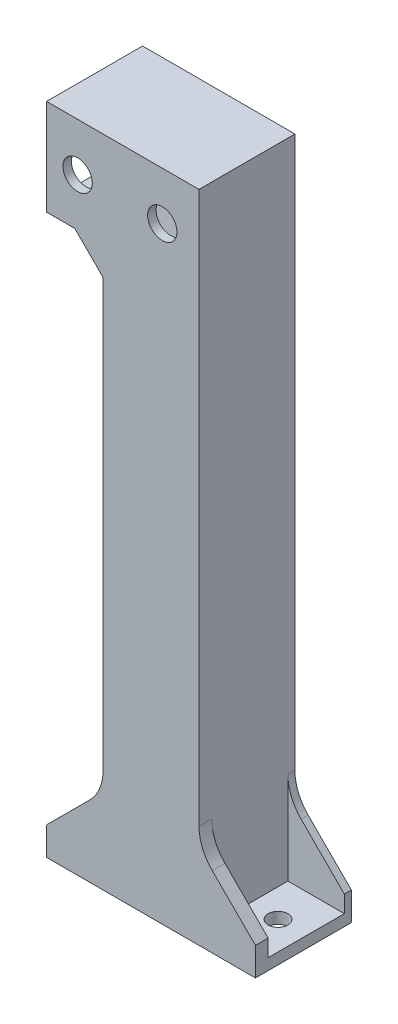
ISO-10303-21;
HEADER;
FILE_DESCRIPTION(('STEP AP214'),'2;1');
FILE_NAME('part.step','',(''),(''),'','','');
FILE_SCHEMA(('AUTOMOTIVE_DESIGN { 1 0 10303 214 1 1 1 1 }'));
ENDSEC;
DATA;
#1=APPLICATION_CONTEXT('core data for automotive mechanical design processes');
#2=APPLICATION_PROTOCOL_DEFINITION('international standard','automotive_design',2000,#1);
#3=PRODUCT_CONTEXT('',#1,'mechanical');
#4=PRODUCT('Part','Part','',(#3));
#5=PRODUCT_RELATED_PRODUCT_CATEGORY('part','',(#4));
#6=PRODUCT_DEFINITION_FORMATION('','',#4);
#7=PRODUCT_DEFINITION_CONTEXT('part definition',#1,'design');
#8=PRODUCT_DEFINITION('design','',#6,#7);
#9=PRODUCT_DEFINITION_SHAPE('','',#8);
#10=(LENGTH_UNIT() NAMED_UNIT(*) SI_UNIT(.MILLI.,.METRE.));
#11=(NAMED_UNIT(*) PLANE_ANGLE_UNIT() SI_UNIT($,.RADIAN.));
#12=(NAMED_UNIT(*) SI_UNIT($,.STERADIAN.) SOLID_ANGLE_UNIT());
#13=UNCERTAINTY_MEASURE_WITH_UNIT(LENGTH_MEASURE(1.E-05),#10,'distance_accuracy_value','');
#14=(GEOMETRIC_REPRESENTATION_CONTEXT(3) GLOBAL_UNCERTAINTY_ASSIGNED_CONTEXT((#13)) GLOBAL_UNIT_ASSIGNED_CONTEXT((#10,
#11,#12)) REPRESENTATION_CONTEXT('',''));
#15=CARTESIAN_POINT('',(0.,0.,0.));
#16=DIRECTION('',(0.,0.,1.));
#17=DIRECTION('',(1.,0.,0.));
#18=AXIS2_PLACEMENT_3D('',#15,#16,#17);
#19=CARTESIAN_POINT('',(1.5,114.5,15.5));
#20=DIRECTION('',(1.,0.,0.));
#21=DIRECTION('',(0.,0.,-1.));
#22=AXIS2_PLACEMENT_3D('',#19,#20,#21);
#23=PLANE('',#22);
#24=DIRECTION('',(0.,-1.,0.));
#25=VECTOR('',#24,1.);
#26=CARTESIAN_POINT('',(1.5,114.5,1.5));
#27=LINE('',#26,#25);
#28=CARTESIAN_POINT('',(1.5,94.6213203435596,1.5));
#29=VERTEX_POINT('',#28);
#30=CARTESIAN_POINT('',(1.5,0.,1.5));
#31=VERTEX_POINT('',#30);
#32=EDGE_CURVE('E58',#29,#31,#27,.T.);
#33=ORIENTED_EDGE('',*,*,#32,.F.);
#34=DIRECTION('',(0.,0.,-1.));
#35=VECTOR('',#34,1.);
#36=CARTESIAN_POINT('',(1.5,94.6213203435596,15.5));
#37=LINE('',#36,#35);
#38=CARTESIAN_POINT('',(1.5,94.6213203435596,15.5));
#39=VERTEX_POINT('',#38);
#40=EDGE_CURVE('E242',#39,#29,#37,.T.);
#41=ORIENTED_EDGE('',*,*,#40,.F.);
#42=DIRECTION('',(0.,-1.,0.));
#43=VECTOR('',#42,1.);
#44=CARTESIAN_POINT('',(1.5,114.5,15.5));
#45=LINE('',#44,#43);
#46=CARTESIAN_POINT('',(1.5,0.,15.5));
#47=VERTEX_POINT('',#46);
#48=EDGE_CURVE('E250',#39,#47,#45,.T.);
#49=ORIENTED_EDGE('',*,*,#48,.T.);
#50=DIRECTION('',(0.,0.,1.));
#51=VECTOR('',#50,1.);
#52=CARTESIAN_POINT('',(1.5,0.,15.5));
#53=LINE('',#52,#51);
#54=EDGE_CURVE('E256',#31,#47,#53,.T.);
#55=ORIENTED_EDGE('',*,*,#54,.F.);
#56=EDGE_LOOP('',(#33,#41,#49,#55));
#57=FACE_BOUND('',#56,.T.);
#58=ADVANCED_FACE('F33',(#57),#23,.T.);
#59=CARTESIAN_POINT('',(15.5,100.5,1.5));
#60=DIRECTION('',(0.,1.,0.));
#61=DIRECTION('',(0.,0.,1.));
#62=AXIS2_PLACEMENT_3D('',#59,#60,#61);
#63=PLANE('',#62);
#64=DIRECTION('',(-1.,0.,0.));
#65=VECTOR('',#64,1.);
#66=CARTESIAN_POINT('',(15.5,100.5,15.5));
#67=LINE('',#66,#65);
#68=CARTESIAN_POINT('',(-4.37867965644037,100.5,15.5));
#69=VERTEX_POINT('',#68);
#70=CARTESIAN_POINT('',(-10.,100.5,15.5));
#71=VERTEX_POINT('',#70);
#72=EDGE_CURVE('E248',#69,#71,#67,.T.);
#73=ORIENTED_EDGE('',*,*,#72,.F.);
#74=DIRECTION('',(0.,0.,-1.));
#75=VECTOR('',#74,1.);
#76=CARTESIAN_POINT('',(-4.37867965644037,100.5,15.5));
#77=LINE('',#76,#75);
#78=CARTESIAN_POINT('',(-4.37867965644037,100.5,1.5));
#79=VERTEX_POINT('',#78);
#80=EDGE_CURVE('E233',#69,#79,#77,.T.);
#81=ORIENTED_EDGE('',*,*,#80,.T.);
#82=DIRECTION('',(-1.,0.,0.));
#83=VECTOR('',#82,1.);
#84=CARTESIAN_POINT('',(15.5,100.5,1.5));
#85=LINE('',#84,#83);
#86=CARTESIAN_POINT('',(-9.99999999999999,100.5,1.5));
#87=VERTEX_POINT('',#86);
#88=EDGE_CURVE('E50',#79,#87,#85,.T.);
#89=ORIENTED_EDGE('',*,*,#88,.T.);
#90=DIRECTION('',(0.,0.,-1.));
#91=VECTOR('',#90,1.);
#92=CARTESIAN_POINT('',(-10.,100.5,1.5));
#93=LINE('',#92,#91);
#94=EDGE_CURVE('E254',#71,#87,#93,.T.);
#95=ORIENTED_EDGE('',*,*,#94,.F.);
#96=EDGE_LOOP('',(#73,#81,#89,#95));
#97=FACE_BOUND('',#96,.T.);
#98=ADVANCED_FACE('F252',(#97),#63,.T.);
#99=CARTESIAN_POINT('',(-9.99999999999999,116.,17.));
#100=DIRECTION('',(1.,0.,0.));
#101=DIRECTION('',(0.,1.,0.));
#102=AXIS2_PLACEMENT_3D('',#99,#100,#101);
#103=PLANE('',#102);
#104=DIRECTION('',(0.,-1.,0.));
#105=VECTOR('',#104,1.);
#106=CARTESIAN_POINT('',(-9.99999999999999,116.,0.));
#107=LINE('',#106,#105);
#108=CARTESIAN_POINT('',(-9.99999999999999,116.,0.));
#109=VERTEX_POINT('',#108);
#110=CARTESIAN_POINT('',(-9.99999999999999,99.,0.));
#111=VERTEX_POINT('',#110);
#112=EDGE_CURVE('E396',#109,#111,#107,.T.);
#113=ORIENTED_EDGE('',*,*,#112,.T.);
#114=DIRECTION('',(0.,0.,-1.));
#115=VECTOR('',#114,1.);
#116=CARTESIAN_POINT('',(-9.99999999999999,99.,17.));
#117=LINE('',#116,#115);
#118=CARTESIAN_POINT('',(-9.99999999999999,99.,17.));
#119=VERTEX_POINT('',#118);
#120=EDGE_CURVE('E433',#119,#111,#117,.T.);
#121=ORIENTED_EDGE('',*,*,#120,.F.);
#122=DIRECTION('',(0.,-1.,0.));
#123=VECTOR('',#122,1.);
#124=CARTESIAN_POINT('',(-9.99999999999999,116.,17.));
#125=LINE('',#124,#123);
#126=CARTESIAN_POINT('',(-9.99999999999999,116.,17.));
#127=VERTEX_POINT('',#126);
#128=EDGE_CURVE('E367',#127,#119,#125,.T.);
#129=ORIENTED_EDGE('',*,*,#128,.F.);
#130=DIRECTION('',(0.,0.,-1.));
#131=VECTOR('',#130,1.);
#132=CARTESIAN_POINT('',(-9.99999999999999,116.,17.));
#133=LINE('',#132,#131);
#134=EDGE_CURVE('E436',#127,#109,#133,.T.);
#135=ORIENTED_EDGE('',*,*,#134,.T.);
#136=EDGE_LOOP('',(#113,#121,#129,#135));
#137=FACE_BOUND('',#136,.T.);
#138=DIRECTION('',(0.,1.,0.));
#139=VECTOR('',#138,1.);
#140=CARTESIAN_POINT('',(-10.,114.5,1.5));
#141=LINE('',#140,#139);
#142=CARTESIAN_POINT('',(-10.,114.5,1.5));
#143=VERTEX_POINT('',#142);
#144=EDGE_CURVE('E241',#87,#143,#141,.T.);
#145=ORIENTED_EDGE('',*,*,#144,.T.);
#146=DIRECTION('',(0.,0.,1.));
#147=VECTOR('',#146,1.);
#148=CARTESIAN_POINT('',(-10.,114.5,1.5));
#149=LINE('',#148,#147);
#150=CARTESIAN_POINT('',(-10.,114.5,15.5));
#151=VERTEX_POINT('',#150);
#152=EDGE_CURVE('E487',#143,#151,#149,.T.);
#153=ORIENTED_EDGE('',*,*,#152,.T.);
#154=DIRECTION('',(0.,-1.,0.));
#155=VECTOR('',#154,1.);
#156=CARTESIAN_POINT('',(-10.,114.5,15.5));
#157=LINE('',#156,#155);
#158=EDGE_CURVE('E490',#151,#71,#157,.T.);
#159=ORIENTED_EDGE('',*,*,#158,.T.);
#160=ORIENTED_EDGE('',*,*,#94,.T.);
#161=EDGE_LOOP('',(#145,#153,#159,#160));
#162=FACE_BOUND('',#161,.T.);
#163=ADVANCED_FACE('F492',(#137,#162),#103,.F.);
#164=CARTESIAN_POINT('',(27.,0.,17.));
#165=DIRECTION('',(0.,1.,0.));
#166=DIRECTION('',(0.,0.,1.));
#167=AXIS2_PLACEMENT_3D('',#164,#165,#166);
#168=PLANE('',#167);
#169=DIRECTION('',(1.,0.,0.));
#170=VECTOR('',#169,1.);
#171=CARTESIAN_POINT('',(27.,0.,0.));
#172=LINE('',#171,#170);
#173=CARTESIAN_POINT('',(-10.,0.,0.));
#174=VERTEX_POINT('',#173);
#175=CARTESIAN_POINT('',(27.,0.,0.));
#176=VERTEX_POINT('',#175);
#177=EDGE_CURVE('E353',#174,#176,#172,.T.);
#178=ORIENTED_EDGE('',*,*,#177,.T.);
#179=DIRECTION('',(0.,0.,-1.));
#180=VECTOR('',#179,1.);
#181=CARTESIAN_POINT('',(27.,0.,17.));
#182=LINE('',#181,#180);
#183=CARTESIAN_POINT('',(27.,0.,17.));
#184=VERTEX_POINT('',#183);
#185=EDGE_CURVE('E454',#184,#176,#182,.T.);
#186=ORIENTED_EDGE('',*,*,#185,.F.);
#187=DIRECTION('',(1.,0.,0.));
#188=VECTOR('',#187,1.);
#189=CARTESIAN_POINT('',(-10.,0.,17.));
#190=LINE('',#189,#188);
#191=CARTESIAN_POINT('',(-10.,0.,17.));
#192=VERTEX_POINT('',#191);
#193=EDGE_CURVE('E354',#192,#184,#190,.T.);
#194=ORIENTED_EDGE('',*,*,#193,.F.);
#195=DIRECTION('',(0.,0.,-1.));
#196=VECTOR('',#195,1.);
#197=CARTESIAN_POINT('',(-10.,0.,17.));
#198=LINE('',#197,#196);
#199=EDGE_CURVE('E381',#192,#174,#198,.T.);
#200=ORIENTED_EDGE('',*,*,#199,.T.);
#201=EDGE_LOOP('',(#178,#186,#194,#200));
#202=FACE_BOUND('',#201,.T.);
#203=CARTESIAN_POINT('',(-5.00000000000003,0.,8.));
#204=DIRECTION('',(0.,-1.,0.));
#205=DIRECTION('',(1.,0.,0.));
#206=AXIS2_PLACEMENT_3D('',#203,#204,#205);
#207=CIRCLE('',#206,1.75);
#208=CARTESIAN_POINT('',(-3.25000000000004,0.,8.));
#209=VERTEX_POINT('',#208);
#210=EDGE_CURVE('E320',#209,#209,#207,.T.);
#211=ORIENTED_EDGE('',*,*,#210,.F.);
#212=EDGE_LOOP('',(#211));
#213=FACE_BOUND('',#212,.T.);
#214=CARTESIAN_POINT('',(22.,0.,8.));
#215=DIRECTION('',(0.,1.,0.));
#216=DIRECTION('',(-1.,0.,0.));
#217=AXIS2_PLACEMENT_3D('',#214,#215,#216);
#218=CIRCLE('',#217,1.75);
#219=CARTESIAN_POINT('',(20.25,0.,8.));
#220=VERTEX_POINT('',#219);
#221=EDGE_CURVE('E285',#220,#220,#218,.T.);
#222=ORIENTED_EDGE('',*,*,#221,.T.);
#223=EDGE_LOOP('',(#222));
#224=FACE_BOUND('',#223,.T.);
#225=ORIENTED_EDGE('',*,*,#54,.T.);
#226=DIRECTION('',(1.,0.,0.));
#227=VECTOR('',#226,1.);
#228=CARTESIAN_POINT('',(1.5,0.,15.5));
#229=LINE('',#228,#227);
#230=CARTESIAN_POINT('',(15.5,0.,15.5));
#231=VERTEX_POINT('',#230);
#232=EDGE_CURVE('E259',#47,#231,#229,.T.);
#233=ORIENTED_EDGE('',*,*,#232,.T.);
#234=DIRECTION('',(0.,0.,-1.));
#235=VECTOR('',#234,1.);
#236=CARTESIAN_POINT('',(15.5,0.,15.5));
#237=LINE('',#236,#235);
#238=CARTESIAN_POINT('',(15.5,0.,1.5));
#239=VERTEX_POINT('',#238);
#240=EDGE_CURVE('E273',#231,#239,#237,.T.);
#241=ORIENTED_EDGE('',*,*,#240,.T.);
#242=DIRECTION('',(-1.,0.,0.));
#243=VECTOR('',#242,1.);
#244=CARTESIAN_POINT('',(1.5,0.,1.5));
#245=LINE('',#244,#243);
#246=EDGE_CURVE('E267',#239,#31,#245,.T.);
#247=ORIENTED_EDGE('',*,*,#246,.T.);
#248=EDGE_LOOP('',(#225,#233,#241,#247));
#249=FACE_BOUND('',#248,.T.);
#250=ADVANCED_FACE('F35',(#202,#213,#224,#249),#168,.F.);
#251=CARTESIAN_POINT('',(27.,5.,17.));
#252=DIRECTION('',(-1.,0.,0.));
#253=DIRECTION('',(0.,0.,1.));
#254=AXIS2_PLACEMENT_3D('',#251,#252,#253);
#255=PLANE('',#254);
#256=DIRECTION('',(0.,-1.,0.));
#257=VECTOR('',#256,1.);
#258=CARTESIAN_POINT('',(26.9999999999999,18.5000000000001,1.25));
#259=LINE('',#258,#257);
#260=CARTESIAN_POINT('',(27.,5.00000000000001,1.25));
#261=VERTEX_POINT('',#260);
#262=CARTESIAN_POINT('',(27.,2.00000000000007,1.25));
#263=VERTEX_POINT('',#262);
#264=EDGE_CURVE('E303',#261,#263,#259,.T.);
#265=ORIENTED_EDGE('',*,*,#264,.T.);
#266=DIRECTION('',(0.,0.,-1.));
#267=VECTOR('',#266,1.);
#268=CARTESIAN_POINT('',(27.,2.00000000000007,1.25));
#269=LINE('',#268,#267);
#270=CARTESIAN_POINT('',(27.,2.00000000000007,14.75));
#271=VERTEX_POINT('',#270);
#272=EDGE_CURVE('E288',#271,#263,#269,.T.);
#273=ORIENTED_EDGE('',*,*,#272,.F.);
#274=DIRECTION('',(0.,-1.,0.));
#275=VECTOR('',#274,1.);
#276=CARTESIAN_POINT('',(26.9999999999999,18.5000000000001,14.75));
#277=LINE('',#276,#275);
#278=CARTESIAN_POINT('',(27.,5.,14.75));
#279=VERTEX_POINT('',#278);
#280=EDGE_CURVE('E302',#279,#271,#277,.T.);
#281=ORIENTED_EDGE('',*,*,#280,.F.);
#282=DIRECTION('',(0.,0.,-1.));
#283=VECTOR('',#282,1.);
#284=CARTESIAN_POINT('',(27.,5.,17.));
#285=LINE('',#284,#283);
#286=CARTESIAN_POINT('',(27.,5.,17.));
#287=VERTEX_POINT('',#286);
#288=EDGE_CURVE('E451',#287,#279,#285,.T.);
#289=ORIENTED_EDGE('',*,*,#288,.F.);
#290=DIRECTION('',(0.,1.,0.));
#291=VECTOR('',#290,1.);
#292=CARTESIAN_POINT('',(27.,5.,17.));
#293=LINE('',#292,#291);
#294=EDGE_CURVE('E356',#184,#287,#293,.T.);
#295=ORIENTED_EDGE('',*,*,#294,.F.);
#296=ORIENTED_EDGE('',*,*,#185,.T.);
#297=DIRECTION('',(0.,1.,0.));
#298=VECTOR('',#297,1.);
#299=CARTESIAN_POINT('',(27.,5.,0.));
#300=LINE('',#299,#298);
#301=CARTESIAN_POINT('',(27.,5.,0.));
#302=VERTEX_POINT('',#301);
#303=EDGE_CURVE('E383',#176,#302,#300,.T.);
#304=ORIENTED_EDGE('',*,*,#303,.T.);
#305=EDGE_CURVE('E450',#261,#302,#285,.T.);
#306=ORIENTED_EDGE('',*,*,#305,.F.);
#307=EDGE_LOOP('',(#265,#273,#281,#289,#295,#296,#304,#306));
#308=FACE_BOUND('',#307,.T.);
#309=ADVANCED_FACE('F600',(#308),#255,.F.);
#310=CARTESIAN_POINT('',(19.3431457505076,12.6568542494924,17.));
#311=DIRECTION('',(-0.707106781186548,-0.707106781186547,0.));
#312=DIRECTION('',(0.707106781186547,-0.707106781186548,0.));
#313=AXIS2_PLACEMENT_3D('',#310,#311,#312);
#314=PLANE('',#313);
#315=DIRECTION('',(-0.707106781186547,0.707106781186548,0.));
#316=VECTOR('',#315,1.);
#317=CARTESIAN_POINT('',(19.3431457505076,12.6568542494924,1.25));
#318=LINE('',#317,#316);
#319=CARTESIAN_POINT('',(19.3431457505076,12.6568542494924,1.25));
#320=VERTEX_POINT('',#319);
#321=EDGE_CURVE('E317',#261,#320,#318,.T.);
#322=ORIENTED_EDGE('',*,*,#321,.F.);
#323=ORIENTED_EDGE('',*,*,#305,.T.);
#324=DIRECTION('',(-0.707106781186547,0.707106781186548,0.));
#325=VECTOR('',#324,1.);
#326=CARTESIAN_POINT('',(19.3431457505076,12.6568542494924,0.));
#327=LINE('',#326,#325);
#328=CARTESIAN_POINT('',(19.3431457505076,12.6568542494924,0.));
#329=VERTEX_POINT('',#328);
#330=EDGE_CURVE('E386',#302,#329,#327,.T.);
#331=ORIENTED_EDGE('',*,*,#330,.T.);
#332=DIRECTION('',(0.,0.,-1.));
#333=VECTOR('',#332,1.);
#334=CARTESIAN_POINT('',(19.3431457505076,12.6568542494924,17.));
#335=LINE('',#334,#333);
#336=EDGE_CURVE('E446',#320,#329,#335,.T.);
#337=ORIENTED_EDGE('',*,*,#336,.F.);
#338=EDGE_LOOP('',(#322,#323,#331,#337));
#339=FACE_BOUND('',#338,.T.);
#340=ADVANCED_FACE('F598',(#339),#314,.F.);
#341=DIRECTION('',(0.707106781186547,-0.707106781186548,0.));
#342=VECTOR('',#341,1.);
#343=CARTESIAN_POINT('',(19.3431457505076,12.6568542494924,14.75));
#344=LINE('',#343,#342);
#345=CARTESIAN_POINT('',(19.3431457505076,12.6568542494924,14.75));
#346=VERTEX_POINT('',#345);
#347=EDGE_CURVE('E313',#346,#279,#344,.T.);
#348=ORIENTED_EDGE('',*,*,#347,.F.);
#349=CARTESIAN_POINT('',(19.3431457505076,12.6568542494924,17.));
#350=VERTEX_POINT('',#349);
#351=EDGE_CURVE('E447',#350,#346,#335,.T.);
#352=ORIENTED_EDGE('',*,*,#351,.F.);
#353=DIRECTION('',(-0.707106781186547,0.707106781186548,0.));
#354=VECTOR('',#353,1.);
#355=CARTESIAN_POINT('',(19.3431457505076,12.6568542494924,17.));
#356=LINE('',#355,#354);
#357=EDGE_CURVE('E359',#287,#350,#356,.T.);
#358=ORIENTED_EDGE('',*,*,#357,.F.);
#359=ORIENTED_EDGE('',*,*,#288,.T.);
#360=EDGE_LOOP('',(#348,#352,#358,#359));
#361=FACE_BOUND('',#360,.T.);
#362=ADVANCED_FACE('F596',(#361),#314,.F.);
#363=CARTESIAN_POINT('',(25.,18.3137084989848,17.));
#364=DIRECTION('',(0.,0.,-1.));
#365=DIRECTION('',(-1.,0.,0.));
#366=AXIS2_PLACEMENT_3D('',#363,#364,#365);
#367=CYLINDRICAL_SURFACE('',#366,8.);
#368=CARTESIAN_POINT('',(25.,18.3137084989848,1.25));
#369=DIRECTION('',(0.,0.,1.));
#370=DIRECTION('',(1.,0.,0.));
#371=AXIS2_PLACEMENT_3D('',#368,#369,#370);
#372=CIRCLE('',#371,8.);
#373=CARTESIAN_POINT('',(16.9999999999999,18.3137084989848,1.25));
#374=VERTEX_POINT('',#373);
#375=EDGE_CURVE('E315',#320,#374,#372,.F.);
#376=ORIENTED_EDGE('',*,*,#375,.F.);
#377=ORIENTED_EDGE('',*,*,#336,.T.);
#378=CARTESIAN_POINT('',(25.,18.3137084989848,0.));
#379=DIRECTION('',(0.,0.,-1.));
#380=DIRECTION('',(1.,0.,0.));
#381=AXIS2_PLACEMENT_3D('',#378,#379,#380);
#382=CIRCLE('',#381,8.);
#383=CARTESIAN_POINT('',(17.,18.3137084989848,0.));
#384=VERTEX_POINT('',#383);
#385=EDGE_CURVE('E389',#329,#384,#382,.T.);
#386=ORIENTED_EDGE('',*,*,#385,.T.);
#387=DIRECTION('',(0.,0.,-1.));
#388=VECTOR('',#387,1.);
#389=CARTESIAN_POINT('',(17.,18.3137084989848,17.));
#390=LINE('',#389,#388);
#391=EDGE_CURVE('E442',#374,#384,#390,.T.);
#392=ORIENTED_EDGE('',*,*,#391,.F.);
#393=EDGE_LOOP('',(#376,#377,#386,#392));
#394=FACE_BOUND('',#393,.T.);
#395=ADVANCED_FACE('F592',(#394),#367,.F.);
#396=CARTESIAN_POINT('',(25.,18.3137084989848,14.75));
#397=DIRECTION('',(0.,0.,-1.));
#398=DIRECTION('',(-1.,0.,0.));
#399=AXIS2_PLACEMENT_3D('',#396,#397,#398);
#400=CIRCLE('',#399,8.);
#401=CARTESIAN_POINT('',(17.,18.3137084989848,14.75));
#402=VERTEX_POINT('',#401);
#403=EDGE_CURVE('E306',#402,#346,#400,.F.);
#404=ORIENTED_EDGE('',*,*,#403,.F.);
#405=CARTESIAN_POINT('',(17.,18.3137084989848,17.));
#406=VERTEX_POINT('',#405);
#407=EDGE_CURVE('E443',#406,#402,#390,.T.);
#408=ORIENTED_EDGE('',*,*,#407,.F.);
#409=CARTESIAN_POINT('',(25.,18.3137084989848,17.));
#410=DIRECTION('',(0.,0.,-1.));
#411=DIRECTION('',(1.,0.,0.));
#412=AXIS2_PLACEMENT_3D('',#409,#410,#411);
#413=CIRCLE('',#412,8.);
#414=EDGE_CURVE('E361',#350,#406,#413,.T.);
#415=ORIENTED_EDGE('',*,*,#414,.F.);
#416=ORIENTED_EDGE('',*,*,#351,.T.);
#417=EDGE_LOOP('',(#404,#408,#415,#416));
#418=FACE_BOUND('',#417,.T.);
#419=ADVANCED_FACE('F595',(#418),#367,.F.);
#420=CARTESIAN_POINT('',(-8.,18.3137084989848,17.));
#421=DIRECTION('',(0.,0.,-1.));
#422=DIRECTION('',(-1.,0.,0.));
#423=AXIS2_PLACEMENT_3D('',#420,#421,#422);
#424=CYLINDRICAL_SURFACE('',#423,8.);
#425=DIRECTION('',(0.,0.,-1.));
#426=VECTOR('',#425,1.);
#427=CARTESIAN_POINT('',(0.,18.3137084989848,17.));
#428=LINE('',#427,#426);
#429=CARTESIAN_POINT('',(0.,18.3137084989848,17.));
#430=VERTEX_POINT('',#429);
#431=CARTESIAN_POINT('',(0.,18.3137084989847,14.75));
#432=VERTEX_POINT('',#431);
#433=EDGE_CURVE('E424',#430,#432,#428,.T.);
#434=ORIENTED_EDGE('',*,*,#433,.T.);
#435=CARTESIAN_POINT('',(-8.,18.3137084989848,14.75));
#436=DIRECTION('',(0.,0.,1.));
#437=DIRECTION('',(1.,0.,0.));
#438=AXIS2_PLACEMENT_3D('',#435,#436,#437);
#439=CIRCLE('',#438,8.);
#440=CARTESIAN_POINT('',(-2.34314575050762,12.6568542494924,14.75));
#441=VERTEX_POINT('',#440);
#442=EDGE_CURVE('E350',#432,#441,#439,.F.);
#443=ORIENTED_EDGE('',*,*,#442,.T.);
#444=DIRECTION('',(0.,0.,-1.));
#445=VECTOR('',#444,1.);
#446=CARTESIAN_POINT('',(-2.34314575050762,12.6568542494924,17.));
#447=LINE('',#446,#445);
#448=CARTESIAN_POINT('',(-2.34314575050762,12.6568542494924,17.));
#449=VERTEX_POINT('',#448);
#450=EDGE_CURVE('E420',#449,#441,#447,.T.);
#451=ORIENTED_EDGE('',*,*,#450,.F.);
#452=CARTESIAN_POINT('',(-8.,18.3137084989848,17.));
#453=DIRECTION('',(0.,0.,-1.));
#454=DIRECTION('',(-1.,0.,0.));
#455=AXIS2_PLACEMENT_3D('',#452,#453,#454);
#456=CIRCLE('',#455,8.);
#457=EDGE_CURVE('E375',#430,#449,#456,.T.);
#458=ORIENTED_EDGE('',*,*,#457,.F.);
#459=EDGE_LOOP('',(#434,#443,#451,#458));
#460=FACE_BOUND('',#459,.T.);
#461=ADVANCED_FACE('F569',(#460),#424,.F.);
#462=CARTESIAN_POINT('',(-2.34314575050762,12.6568542494924,17.));
#463=DIRECTION('',(0.707106781186547,-0.707106781186548,0.));
#464=DIRECTION('',(0.707106781186548,0.707106781186547,0.));
#465=AXIS2_PLACEMENT_3D('',#462,#463,#464);
#466=PLANE('',#465);
#467=ORIENTED_EDGE('',*,*,#450,.T.);
#468=DIRECTION('',(-0.707106781186548,-0.707106781186547,0.));
#469=VECTOR('',#468,1.);
#470=CARTESIAN_POINT('',(-2.34314575050762,12.6568542494924,14.75));
#471=LINE('',#470,#469);
#472=CARTESIAN_POINT('',(-10.,5.,14.75));
#473=VERTEX_POINT('',#472);
#474=EDGE_CURVE('E347',#441,#473,#471,.T.);
#475=ORIENTED_EDGE('',*,*,#474,.T.);
#476=DIRECTION('',(0.,0.,-1.));
#477=VECTOR('',#476,1.);
#478=CARTESIAN_POINT('',(-10.,5.,17.));
#479=LINE('',#478,#477);
#480=CARTESIAN_POINT('',(-10.,5.,17.));
#481=VERTEX_POINT('',#480);
#482=EDGE_CURVE('E416',#481,#473,#479,.T.);
#483=ORIENTED_EDGE('',*,*,#482,.F.);
#484=DIRECTION('',(-0.707106781186548,-0.707106781186547,0.));
#485=VECTOR('',#484,1.);
#486=CARTESIAN_POINT('',(-2.34314575050762,12.6568542494924,17.));
#487=LINE('',#486,#485);
#488=EDGE_CURVE('E377',#449,#481,#487,.T.);
#489=ORIENTED_EDGE('',*,*,#488,.F.);
#490=EDGE_LOOP('',(#467,#475,#483,#489));
#491=FACE_BOUND('',#490,.T.);
#492=ADVANCED_FACE('F564',(#491),#466,.F.);
#493=CARTESIAN_POINT('',(17.,116.,17.));
#494=DIRECTION('',(-1.,0.,0.));
#495=DIRECTION('',(0.,0.,1.));
#496=AXIS2_PLACEMENT_3D('',#493,#494,#495);
#497=PLANE('',#496);
#498=ORIENTED_EDGE('',*,*,#407,.T.);
#499=DIRECTION('',(0.,-1.,0.));
#500=VECTOR('',#499,1.);
#501=CARTESIAN_POINT('',(16.9999999999999,18.5,14.75));
#502=LINE('',#501,#500);
#503=CARTESIAN_POINT('',(17.,2.,14.75));
#504=VERTEX_POINT('',#503);
#505=EDGE_CURVE('E309',#402,#504,#502,.T.);
#506=ORIENTED_EDGE('',*,*,#505,.T.);
#507=DIRECTION('',(0.,0.,1.));
#508=VECTOR('',#507,1.);
#509=CARTESIAN_POINT('',(17.,2.,1.25));
#510=LINE('',#509,#508);
#511=CARTESIAN_POINT('',(17.,2.,1.25));
#512=VERTEX_POINT('',#511);
#513=EDGE_CURVE('E296',#512,#504,#510,.T.);
#514=ORIENTED_EDGE('',*,*,#513,.F.);
#515=DIRECTION('',(0.,-1.,0.));
#516=VECTOR('',#515,1.);
#517=CARTESIAN_POINT('',(16.9999999999999,18.5,1.25));
#518=LINE('',#517,#516);
#519=EDGE_CURVE('E307',#374,#512,#518,.T.);
#520=ORIENTED_EDGE('',*,*,#519,.F.);
#521=ORIENTED_EDGE('',*,*,#391,.T.);
#522=DIRECTION('',(0.,1.,0.));
#523=VECTOR('',#522,1.);
#524=CARTESIAN_POINT('',(17.,116.,0.));
#525=LINE('',#524,#523);
#526=CARTESIAN_POINT('',(17.,116.,0.));
#527=VERTEX_POINT('',#526);
#528=EDGE_CURVE('E392',#384,#527,#525,.T.);
#529=ORIENTED_EDGE('',*,*,#528,.T.);
#530=DIRECTION('',(0.,0.,-1.));
#531=VECTOR('',#530,1.);
#532=CARTESIAN_POINT('',(17.,116.,17.));
#533=LINE('',#532,#531);
#534=CARTESIAN_POINT('',(17.,116.,17.));
#535=VERTEX_POINT('',#534);
#536=EDGE_CURVE('E439',#535,#527,#533,.T.);
#537=ORIENTED_EDGE('',*,*,#536,.F.);
#538=DIRECTION('',(0.,1.,0.));
#539=VECTOR('',#538,1.);
#540=CARTESIAN_POINT('',(17.,116.,17.));
#541=LINE('',#540,#539);
#542=EDGE_CURVE('E363',#406,#535,#541,.T.);
#543=ORIENTED_EDGE('',*,*,#542,.F.);
#544=EDGE_LOOP('',(#498,#506,#514,#520,#521,#529,#537,#543));
#545=FACE_BOUND('',#544,.T.);
#546=ADVANCED_FACE('F587',(#545),#497,.F.);
#547=CARTESIAN_POINT('',(17.,116.,17.));
#548=DIRECTION('',(0.,-1.,0.));
#549=DIRECTION('',(1.,0.,0.));
#550=AXIS2_PLACEMENT_3D('',#547,#548,#549);
#551=PLANE('',#550);
#552=DIRECTION('',(-1.,0.,0.));
#553=VECTOR('',#552,1.);
#554=CARTESIAN_POINT('',(17.,116.,0.));
#555=LINE('',#554,#553);
#556=EDGE_CURVE('E394',#527,#109,#555,.T.);
#557=ORIENTED_EDGE('',*,*,#556,.T.);
#558=ORIENTED_EDGE('',*,*,#134,.F.);
#559=DIRECTION('',(-1.,0.,0.));
#560=VECTOR('',#559,1.);
#561=CARTESIAN_POINT('',(17.,116.,17.));
#562=LINE('',#561,#560);
#563=EDGE_CURVE('E365',#535,#127,#562,.T.);
#564=ORIENTED_EDGE('',*,*,#563,.F.);
#565=ORIENTED_EDGE('',*,*,#536,.T.);
#566=EDGE_LOOP('',(#557,#558,#564,#565));
#567=FACE_BOUND('',#566,.T.);
#568=ADVANCED_FACE('F580',(#567),#551,.F.);
#569=CARTESIAN_POINT('',(-5.,99.,17.));
#570=DIRECTION('',(0.,1.,0.));
#571=DIRECTION('',(0.,0.,1.));
#572=AXIS2_PLACEMENT_3D('',#569,#570,#571);
#573=PLANE('',#572);
#574=DIRECTION('',(1.,0.,0.));
#575=VECTOR('',#574,1.);
#576=CARTESIAN_POINT('',(-5.,99.,0.));
#577=LINE('',#576,#575);
#578=CARTESIAN_POINT('',(-5.,99.,0.));
#579=VERTEX_POINT('',#578);
#580=EDGE_CURVE('E398',#111,#579,#577,.T.);
#581=ORIENTED_EDGE('',*,*,#580,.T.);
#582=DIRECTION('',(0.,0.,-1.));
#583=VECTOR('',#582,1.);
#584=CARTESIAN_POINT('',(-5.,99.,17.));
#585=LINE('',#584,#583);
#586=CARTESIAN_POINT('',(-5.,99.,17.));
#587=VERTEX_POINT('',#586);
#588=EDGE_CURVE('E430',#587,#579,#585,.T.);
#589=ORIENTED_EDGE('',*,*,#588,.F.);
#590=DIRECTION('',(1.,0.,0.));
#591=VECTOR('',#590,1.);
#592=CARTESIAN_POINT('',(-5.,99.,17.));
#593=LINE('',#592,#591);
#594=EDGE_CURVE('E369',#119,#587,#593,.T.);
#595=ORIENTED_EDGE('',*,*,#594,.F.);
#596=ORIENTED_EDGE('',*,*,#120,.T.);
#597=EDGE_LOOP('',(#581,#589,#595,#596));
#598=FACE_BOUND('',#597,.T.);
#599=ADVANCED_FACE('F576',(#598),#573,.F.);
#600=CARTESIAN_POINT('',(-5.,99.,17.));
#601=DIRECTION('',(0.70710678118655,0.707106781186545,0.));
#602=DIRECTION('',(-0.707106781186545,0.70710678118655,0.));
#603=AXIS2_PLACEMENT_3D('',#600,#601,#602);
#604=PLANE('',#603);
#605=DIRECTION('',(0.707106781186545,-0.70710678118655,0.));
#606=VECTOR('',#605,1.);
#607=CARTESIAN_POINT('',(-5.,99.,0.));
#608=LINE('',#607,#606);
#609=CARTESIAN_POINT('',(0.,94.,0.));
#610=VERTEX_POINT('',#609);
#611=EDGE_CURVE('E400',#579,#610,#608,.T.);
#612=ORIENTED_EDGE('',*,*,#611,.T.);
#613=DIRECTION('',(0.,0.,-1.));
#614=VECTOR('',#613,1.);
#615=CARTESIAN_POINT('',(0.,94.,17.));
#616=LINE('',#615,#614);
#617=CARTESIAN_POINT('',(0.,94.,17.));
#618=VERTEX_POINT('',#617);
#619=EDGE_CURVE('E427',#618,#610,#616,.T.);
#620=ORIENTED_EDGE('',*,*,#619,.F.);
#621=DIRECTION('',(0.707106781186545,-0.70710678118655,0.));
#622=VECTOR('',#621,1.);
#623=CARTESIAN_POINT('',(-5.,99.,17.));
#624=LINE('',#623,#622);
#625=EDGE_CURVE('E371',#587,#618,#624,.T.);
#626=ORIENTED_EDGE('',*,*,#625,.F.);
#627=ORIENTED_EDGE('',*,*,#588,.T.);
#628=EDGE_LOOP('',(#612,#620,#626,#627));
#629=FACE_BOUND('',#628,.T.);
#630=ADVANCED_FACE('F572',(#629),#604,.F.);
#631=CARTESIAN_POINT('',(0.,18.3137084989848,17.));
#632=DIRECTION('',(1.,0.,0.));
#633=DIRECTION('',(0.,0.,-1.));
#634=AXIS2_PLACEMENT_3D('',#631,#632,#633);
#635=PLANE('',#634);
#636=DIRECTION('',(0.,-1.,0.));
#637=VECTOR('',#636,1.);
#638=CARTESIAN_POINT('',(0.,18.5,14.75));
#639=LINE('',#638,#637);
#640=CARTESIAN_POINT('',(0.,2.,14.75));
#641=VERTEX_POINT('',#640);
#642=EDGE_CURVE('E338',#432,#641,#639,.T.);
#643=ORIENTED_EDGE('',*,*,#642,.F.);
#644=ORIENTED_EDGE('',*,*,#433,.F.);
#645=DIRECTION('',(0.,-1.,0.));
#646=VECTOR('',#645,1.);
#647=CARTESIAN_POINT('',(0.,18.3137084989848,17.));
#648=LINE('',#647,#646);
#649=EDGE_CURVE('E373',#618,#430,#648,.T.);
#650=ORIENTED_EDGE('',*,*,#649,.F.);
#651=ORIENTED_EDGE('',*,*,#619,.T.);
#652=DIRECTION('',(0.,-1.,0.));
#653=VECTOR('',#652,1.);
#654=CARTESIAN_POINT('',(0.,18.3137084989848,0.));
#655=LINE('',#654,#653);
#656=CARTESIAN_POINT('',(0.,18.3137084989848,0.));
#657=VERTEX_POINT('',#656);
#658=EDGE_CURVE('E402',#610,#657,#655,.T.);
#659=ORIENTED_EDGE('',*,*,#658,.T.);
#660=CARTESIAN_POINT('',(0.,18.3137084989847,1.25));
#661=VERTEX_POINT('',#660);
#662=EDGE_CURVE('E423',#661,#657,#428,.T.);
#663=ORIENTED_EDGE('',*,*,#662,.F.);
#664=DIRECTION('',(0.,-1.,0.));
#665=VECTOR('',#664,1.);
#666=CARTESIAN_POINT('',(0.,18.5,1.25));
#667=LINE('',#666,#665);
#668=CARTESIAN_POINT('',(0.,2.,1.25));
#669=VERTEX_POINT('',#668);
#670=EDGE_CURVE('E337',#661,#669,#667,.T.);
#671=ORIENTED_EDGE('',*,*,#670,.T.);
#672=DIRECTION('',(0.,0.,1.));
#673=VECTOR('',#672,1.);
#674=CARTESIAN_POINT('',(0.,2.,1.25));
#675=LINE('',#674,#673);
#676=EDGE_CURVE('E331',#669,#641,#675,.T.);
#677=ORIENTED_EDGE('',*,*,#676,.T.);
#678=EDGE_LOOP('',(#643,#644,#650,#651,#659,#663,#671,#677));
#679=FACE_BOUND('',#678,.T.);
#680=ADVANCED_FACE('F567',(#679),#635,.F.);
#681=CARTESIAN_POINT('',(-2.34314575050763,12.6568542494924,1.25));
#682=VERTEX_POINT('',#681);
#683=CARTESIAN_POINT('',(-2.34314575050762,12.6568542494924,0.));
#684=VERTEX_POINT('',#683);
#685=EDGE_CURVE('E419',#682,#684,#447,.T.);
#686=ORIENTED_EDGE('',*,*,#685,.F.);
#687=CARTESIAN_POINT('',(-8.,18.3137084989848,1.25));
#688=DIRECTION('',(0.,0.,-1.));
#689=DIRECTION('',(-1.,0.,0.));
#690=AXIS2_PLACEMENT_3D('',#687,#688,#689);
#691=CIRCLE('',#690,8.);
#692=EDGE_CURVE('E344',#682,#661,#691,.F.);
#693=ORIENTED_EDGE('',*,*,#692,.T.);
#694=ORIENTED_EDGE('',*,*,#662,.T.);
#695=CARTESIAN_POINT('',(-8.,18.3137084989848,0.));
#696=DIRECTION('',(0.,0.,-1.));
#697=DIRECTION('',(-1.,0.,0.));
#698=AXIS2_PLACEMENT_3D('',#695,#696,#697);
#699=CIRCLE('',#698,8.);
#700=EDGE_CURVE('E405',#657,#684,#699,.T.);
#701=ORIENTED_EDGE('',*,*,#700,.T.);
#702=EDGE_LOOP('',(#686,#693,#694,#701));
#703=FACE_BOUND('',#702,.T.);
#704=ADVANCED_FACE('F562',(#703),#424,.F.);
#705=CARTESIAN_POINT('',(-10.,5.,1.25));
#706=VERTEX_POINT('',#705);
#707=CARTESIAN_POINT('',(-10.,5.,0.));
#708=VERTEX_POINT('',#707);
#709=EDGE_CURVE('E415',#706,#708,#479,.T.);
#710=ORIENTED_EDGE('',*,*,#709,.F.);
#711=DIRECTION('',(0.707106781186548,0.707106781186547,0.));
#712=VECTOR('',#711,1.);
#713=CARTESIAN_POINT('',(-2.34314575050762,12.6568542494924,1.25));
#714=LINE('',#713,#712);
#715=EDGE_CURVE('E340',#706,#682,#714,.T.);
#716=ORIENTED_EDGE('',*,*,#715,.T.);
#717=ORIENTED_EDGE('',*,*,#685,.T.);
#718=DIRECTION('',(-0.707106781186548,-0.707106781186547,0.));
#719=VECTOR('',#718,1.);
#720=CARTESIAN_POINT('',(-2.34314575050762,12.6568542494924,0.));
#721=LINE('',#720,#719);
#722=EDGE_CURVE('E408',#684,#708,#721,.T.);
#723=ORIENTED_EDGE('',*,*,#722,.T.);
#724=EDGE_LOOP('',(#710,#716,#717,#723));
#725=FACE_BOUND('',#724,.T.);
#726=ADVANCED_FACE('F558',(#725),#466,.F.);
#727=CARTESIAN_POINT('',(-10.,5.,17.));
#728=DIRECTION('',(1.,0.,0.));
#729=DIRECTION('',(0.,1.,0.));
#730=AXIS2_PLACEMENT_3D('',#727,#728,#729);
#731=PLANE('',#730);
#732=ORIENTED_EDGE('',*,*,#482,.T.);
#733=DIRECTION('',(0.,-1.,0.));
#734=VECTOR('',#733,1.);
#735=CARTESIAN_POINT('',(-10.,5.,14.75));
#736=LINE('',#735,#734);
#737=CARTESIAN_POINT('',(-10.,2.00000000000007,14.75));
#738=VERTEX_POINT('',#737);
#739=EDGE_CURVE('E11',#473,#738,#736,.T.);
#740=ORIENTED_EDGE('',*,*,#739,.T.);
#741=DIRECTION('',(0.,0.,-1.));
#742=VECTOR('',#741,1.);
#743=CARTESIAN_POINT('',(-10.,2.00000000000007,1.25));
#744=LINE('',#743,#742);
#745=CARTESIAN_POINT('',(-10.,2.00000000000007,1.25));
#746=VERTEX_POINT('',#745);
#747=EDGE_CURVE('E323',#738,#746,#744,.T.);
#748=ORIENTED_EDGE('',*,*,#747,.T.);
#749=DIRECTION('',(0.,1.,0.));
#750=VECTOR('',#749,1.);
#751=CARTESIAN_POINT('',(-10.,5.,1.25));
#752=LINE('',#751,#750);
#753=EDGE_CURVE('E42',#746,#706,#752,.T.);
#754=ORIENTED_EDGE('',*,*,#753,.T.);
#755=ORIENTED_EDGE('',*,*,#709,.T.);
#756=DIRECTION('',(0.,-1.,0.));
#757=VECTOR('',#756,1.);
#758=CARTESIAN_POINT('',(-10.,5.,0.));
#759=LINE('',#758,#757);
#760=EDGE_CURVE('E357',#708,#174,#759,.T.);
#761=ORIENTED_EDGE('',*,*,#760,.T.);
#762=ORIENTED_EDGE('',*,*,#199,.F.);
#763=DIRECTION('',(0.,-1.,0.));
#764=VECTOR('',#763,1.);
#765=CARTESIAN_POINT('',(-10.,5.,17.));
#766=LINE('',#765,#764);
#767=EDGE_CURVE('E379',#481,#192,#766,.T.);
#768=ORIENTED_EDGE('',*,*,#767,.F.);
#769=EDGE_LOOP('',(#732,#740,#748,#754,#755,#761,#762,#768));
#770=FACE_BOUND('',#769,.T.);
#771=ADVANCED_FACE('F551',(#770),#731,.F.);
#772=CARTESIAN_POINT('',(25.,18.3137084989848,17.));
#773=DIRECTION('',(0.,0.,1.));
#774=DIRECTION('',(1.,0.,0.));
#775=AXIS2_PLACEMENT_3D('',#772,#773,#774);
#776=PLANE('',#775);
#777=CARTESIAN_POINT('',(10.5,107.5,17.));
#778=DIRECTION('',(0.,0.,1.));
#779=DIRECTION('',(1.,0.,0.));
#780=AXIS2_PLACEMENT_3D('',#777,#778,#779);
#781=CIRCLE('',#780,2.60000000000001);
#782=CARTESIAN_POINT('',(13.1,107.5,17.));
#783=VERTEX_POINT('',#782);
#784=EDGE_CURVE('E461',#783,#783,#781,.T.);
#785=ORIENTED_EDGE('',*,*,#784,.F.);
#786=EDGE_LOOP('',(#785));
#787=FACE_BOUND('',#786,.T.);
#788=CARTESIAN_POINT('',(-4.5,107.5,17.));
#789=DIRECTION('',(0.,0.,1.));
#790=DIRECTION('',(1.,0.,0.));
#791=AXIS2_PLACEMENT_3D('',#788,#789,#790);
#792=CIRCLE('',#791,2.60000000000001);
#793=CARTESIAN_POINT('',(-1.89999999999999,107.5,17.));
#794=VERTEX_POINT('',#793);
#795=EDGE_CURVE('E472',#794,#794,#792,.T.);
#796=ORIENTED_EDGE('',*,*,#795,.F.);
#797=EDGE_LOOP('',(#796));
#798=FACE_BOUND('',#797,.T.);
#799=ORIENTED_EDGE('',*,*,#193,.T.);
#800=ORIENTED_EDGE('',*,*,#294,.T.);
#801=ORIENTED_EDGE('',*,*,#357,.T.);
#802=ORIENTED_EDGE('',*,*,#414,.T.);
#803=ORIENTED_EDGE('',*,*,#542,.T.);
#804=ORIENTED_EDGE('',*,*,#563,.T.);
#805=ORIENTED_EDGE('',*,*,#128,.T.);
#806=ORIENTED_EDGE('',*,*,#594,.T.);
#807=ORIENTED_EDGE('',*,*,#625,.T.);
#808=ORIENTED_EDGE('',*,*,#649,.T.);
#809=ORIENTED_EDGE('',*,*,#457,.T.);
#810=ORIENTED_EDGE('',*,*,#488,.T.);
#811=ORIENTED_EDGE('',*,*,#767,.T.);
#812=EDGE_LOOP('',(#799,#800,#801,#802,#803,#804,#805,#806,#807,#808,#809,#810,#811));
#813=FACE_BOUND('',#812,.T.);
#814=ADVANCED_FACE('F548',(#787,#798,#813),#776,.T.);
#815=CARTESIAN_POINT('',(25.,18.3137084989848,0.));
#816=DIRECTION('',(0.,0.,1.));
#817=DIRECTION('',(1.,0.,0.));
#818=AXIS2_PLACEMENT_3D('',#815,#816,#817);
#819=PLANE('',#818);
#820=CARTESIAN_POINT('',(10.5,107.5,0.));
#821=DIRECTION('',(0.,0.,1.));
#822=DIRECTION('',(1.,0.,0.));
#823=AXIS2_PLACEMENT_3D('',#820,#821,#822);
#824=CIRCLE('',#823,2.60000000000001);
#825=CARTESIAN_POINT('',(13.1,107.5,0.));
#826=VERTEX_POINT('',#825);
#827=EDGE_CURVE('E467',#826,#826,#824,.T.);
#828=ORIENTED_EDGE('',*,*,#827,.T.);
#829=EDGE_LOOP('',(#828));
#830=FACE_BOUND('',#829,.T.);
#831=CARTESIAN_POINT('',(-4.5,107.5,0.));
#832=DIRECTION('',(0.,0.,1.));
#833=DIRECTION('',(1.,0.,0.));
#834=AXIS2_PLACEMENT_3D('',#831,#832,#833);
#835=CIRCLE('',#834,2.60000000000001);
#836=CARTESIAN_POINT('',(-1.89999999999999,107.5,0.));
#837=VERTEX_POINT('',#836);
#838=EDGE_CURVE('E477',#837,#837,#835,.T.);
#839=ORIENTED_EDGE('',*,*,#838,.T.);
#840=EDGE_LOOP('',(#839));
#841=FACE_BOUND('',#840,.T.);
#842=ORIENTED_EDGE('',*,*,#177,.F.);
#843=ORIENTED_EDGE('',*,*,#760,.F.);
#844=ORIENTED_EDGE('',*,*,#722,.F.);
#845=ORIENTED_EDGE('',*,*,#700,.F.);
#846=ORIENTED_EDGE('',*,*,#658,.F.);
#847=ORIENTED_EDGE('',*,*,#611,.F.);
#848=ORIENTED_EDGE('',*,*,#580,.F.);
#849=ORIENTED_EDGE('',*,*,#112,.F.);
#850=ORIENTED_EDGE('',*,*,#556,.F.);
#851=ORIENTED_EDGE('',*,*,#528,.F.);
#852=ORIENTED_EDGE('',*,*,#385,.F.);
#853=ORIENTED_EDGE('',*,*,#330,.F.);
#854=ORIENTED_EDGE('',*,*,#303,.F.);
#855=EDGE_LOOP('',(#842,#843,#844,#845,#846,#847,#848,#849,#850,#851,#852,#853,#854));
#856=FACE_BOUND('',#855,.T.);
#857=ADVANCED_FACE('F543',(#830,#841,#856),#819,.F.);
#858=CARTESIAN_POINT('',(-9.99999999999991,18.5000000000001,14.75));
#859=DIRECTION('',(0.,0.,1.));
#860=DIRECTION('',(1.,0.,0.));
#861=AXIS2_PLACEMENT_3D('',#858,#859,#860);
#862=PLANE('',#861);
#863=ORIENTED_EDGE('',*,*,#642,.T.);
#864=DIRECTION('',(-1.,0.,0.));
#865=VECTOR('',#864,1.);
#866=CARTESIAN_POINT('',(-10.,2.00000000000007,14.75));
#867=LINE('',#866,#865);
#868=EDGE_CURVE('E334',#641,#738,#867,.T.);
#869=ORIENTED_EDGE('',*,*,#868,.T.);
#870=ORIENTED_EDGE('',*,*,#739,.F.);
#871=ORIENTED_EDGE('',*,*,#474,.F.);
#872=ORIENTED_EDGE('',*,*,#442,.F.);
#873=EDGE_LOOP('',(#863,#869,#870,#871,#872));
#874=FACE_BOUND('',#873,.T.);
#875=ADVANCED_FACE('F540',(#874),#862,.F.);
#876=CARTESIAN_POINT('',(-9.9999999999999,18.5000000000001,1.25));
#877=DIRECTION('',(0.,0.,-1.));
#878=DIRECTION('',(-1.,0.,0.));
#879=AXIS2_PLACEMENT_3D('',#876,#877,#878);
#880=PLANE('',#879);
#881=ORIENTED_EDGE('',*,*,#715,.F.);
#882=ORIENTED_EDGE('',*,*,#753,.F.);
#883=DIRECTION('',(1.,0.,0.));
#884=VECTOR('',#883,1.);
#885=CARTESIAN_POINT('',(-10.,2.00000000000007,1.25));
#886=LINE('',#885,#884);
#887=EDGE_CURVE('E328',#746,#669,#886,.T.);
#888=ORIENTED_EDGE('',*,*,#887,.T.);
#889=ORIENTED_EDGE('',*,*,#670,.F.);
#890=ORIENTED_EDGE('',*,*,#692,.F.);
#891=EDGE_LOOP('',(#881,#882,#888,#889,#890));
#892=FACE_BOUND('',#891,.T.);
#893=ADVANCED_FACE('F538',(#892),#880,.F.);
#894=CARTESIAN_POINT('',(0.,2.,0.));
#895=DIRECTION('',(0.,1.,0.));
#896=DIRECTION('',(-1.,0.,0.));
#897=AXIS2_PLACEMENT_3D('',#894,#895,#896);
#898=PLANE('',#897);
#899=CARTESIAN_POINT('',(-5.00000000000002,2.00000000000004,8.));
#900=DIRECTION('',(0.,-1.,0.));
#901=DIRECTION('',(1.,0.,0.));
#902=AXIS2_PLACEMENT_3D('',#899,#900,#901);
#903=CIRCLE('',#902,1.75);
#904=CARTESIAN_POINT('',(-3.25000000000002,2.00000000000002,8.));
#905=VERTEX_POINT('',#904);
#906=EDGE_CURVE('E319',#905,#905,#903,.T.);
#907=ORIENTED_EDGE('',*,*,#906,.T.);
#908=EDGE_LOOP('',(#907));
#909=FACE_BOUND('',#908,.T.);
#910=ORIENTED_EDGE('',*,*,#747,.F.);
#911=ORIENTED_EDGE('',*,*,#868,.F.);
#912=ORIENTED_EDGE('',*,*,#676,.F.);
#913=ORIENTED_EDGE('',*,*,#887,.F.);
#914=EDGE_LOOP('',(#910,#911,#912,#913));
#915=FACE_BOUND('',#914,.T.);
#916=ADVANCED_FACE('F534',(#909,#915),#898,.T.);
#917=CARTESIAN_POINT('',(-5.00000000000003,0.,8.));
#918=DIRECTION('',(0.,1.,0.));
#919=DIRECTION('',(-1.,0.,0.));
#920=AXIS2_PLACEMENT_3D('',#917,#918,#919);
#921=CYLINDRICAL_SURFACE('',#920,1.75);
#922=ORIENTED_EDGE('',*,*,#210,.T.);
#923=EDGE_LOOP('',(#922));
#924=FACE_BOUND('',#923,.T.);
#925=ORIENTED_EDGE('',*,*,#906,.F.);
#926=EDGE_LOOP('',(#925));
#927=FACE_BOUND('',#926,.T.);
#928=ADVANCED_FACE('F527',(#924,#927),#921,.F.);
#929=CARTESIAN_POINT('',(26.9999999999999,18.5000000000001,1.25));
#930=DIRECTION('',(0.,0.,1.));
#931=DIRECTION('',(1.,0.,0.));
#932=AXIS2_PLACEMENT_3D('',#929,#930,#931);
#933=PLANE('',#932);
#934=ORIENTED_EDGE('',*,*,#321,.T.);
#935=ORIENTED_EDGE('',*,*,#375,.T.);
#936=ORIENTED_EDGE('',*,*,#519,.T.);
#937=DIRECTION('',(-1.,0.,0.));
#938=VECTOR('',#937,1.);
#939=CARTESIAN_POINT('',(27.,2.00000000000007,1.25));
#940=LINE('',#939,#938);
#941=EDGE_CURVE('E299',#263,#512,#940,.T.);
#942=ORIENTED_EDGE('',*,*,#941,.F.);
#943=ORIENTED_EDGE('',*,*,#264,.F.);
#944=EDGE_LOOP('',(#934,#935,#936,#942,#943));
#945=FACE_BOUND('',#944,.T.);
#946=ADVANCED_FACE('F524',(#945),#933,.T.);
#947=CARTESIAN_POINT('',(26.9999999999999,18.5000000000001,14.75));
#948=DIRECTION('',(0.,0.,-1.));
#949=DIRECTION('',(-1.,0.,0.));
#950=AXIS2_PLACEMENT_3D('',#947,#948,#949);
#951=PLANE('',#950);
#952=ORIENTED_EDGE('',*,*,#347,.T.);
#953=ORIENTED_EDGE('',*,*,#280,.T.);
#954=DIRECTION('',(1.,0.,0.));
#955=VECTOR('',#954,1.);
#956=CARTESIAN_POINT('',(27.,2.00000000000007,14.75));
#957=LINE('',#956,#955);
#958=EDGE_CURVE('E293',#504,#271,#957,.T.);
#959=ORIENTED_EDGE('',*,*,#958,.F.);
#960=ORIENTED_EDGE('',*,*,#505,.F.);
#961=ORIENTED_EDGE('',*,*,#403,.T.);
#962=EDGE_LOOP('',(#952,#953,#959,#960,#961));
#963=FACE_BOUND('',#962,.T.);
#964=ADVANCED_FACE('F522',(#963),#951,.T.);
#965=CARTESIAN_POINT('',(17.,2.,0.));
#966=DIRECTION('',(0.,1.,0.));
#967=DIRECTION('',(1.,0.,0.));
#968=AXIS2_PLACEMENT_3D('',#965,#966,#967);
#969=PLANE('',#968);
#970=CARTESIAN_POINT('',(22.,2.00000000000004,8.));
#971=DIRECTION('',(0.,1.,0.));
#972=DIRECTION('',(-1.,0.,0.));
#973=AXIS2_PLACEMENT_3D('',#970,#971,#972);
#974=CIRCLE('',#973,1.75);
#975=CARTESIAN_POINT('',(20.25,2.00000000000002,8.));
#976=VERTEX_POINT('',#975);
#977=EDGE_CURVE('E284',#976,#976,#974,.T.);
#978=ORIENTED_EDGE('',*,*,#977,.F.);
#979=EDGE_LOOP('',(#978));
#980=FACE_BOUND('',#979,.T.);
#981=ORIENTED_EDGE('',*,*,#272,.T.);
#982=ORIENTED_EDGE('',*,*,#941,.T.);
#983=ORIENTED_EDGE('',*,*,#513,.T.);
#984=ORIENTED_EDGE('',*,*,#958,.T.);
#985=EDGE_LOOP('',(#981,#982,#983,#984));
#986=FACE_BOUND('',#985,.T.);
#987=ADVANCED_FACE('F518',(#980,#986),#969,.T.);
#988=CARTESIAN_POINT('',(22.,0.,8.));
#989=DIRECTION('',(0.,1.,0.));
#990=DIRECTION('',(-1.,0.,0.));
#991=AXIS2_PLACEMENT_3D('',#988,#989,#990);
#992=CYLINDRICAL_SURFACE('',#991,1.75);
#993=ORIENTED_EDGE('',*,*,#221,.F.);
#994=EDGE_LOOP('',(#993));
#995=FACE_BOUND('',#994,.T.);
#996=ORIENTED_EDGE('',*,*,#977,.T.);
#997=EDGE_LOOP('',(#996));
#998=FACE_BOUND('',#997,.T.);
#999=ADVANCED_FACE('F515',(#995,#998),#992,.F.);
#1000=CARTESIAN_POINT('',(1.5,114.5,15.5));
#1001=DIRECTION('',(0.,0.,-1.));
#1002=DIRECTION('',(-1.,0.,0.));
#1003=AXIS2_PLACEMENT_3D('',#1000,#1001,#1002);
#1004=PLANE('',#1003);
#1005=CARTESIAN_POINT('',(10.5,107.5,15.5));
#1006=DIRECTION('',(0.,0.,-1.));
#1007=DIRECTION('',(-1.,0.,0.));
#1008=AXIS2_PLACEMENT_3D('',#1005,#1006,#1007);
#1009=CIRCLE('',#1008,2.60000000000001);
#1010=CARTESIAN_POINT('',(7.9,107.5,15.5));
#1011=VERTEX_POINT('',#1010);
#1012=EDGE_CURVE('E480',#1011,#1011,#1009,.F.);
#1013=ORIENTED_EDGE('',*,*,#1012,.T.);
#1014=EDGE_LOOP('',(#1013));
#1015=FACE_BOUND('',#1014,.T.);
#1016=CARTESIAN_POINT('',(-4.5,107.5,15.5));
#1017=DIRECTION('',(0.,0.,-1.));
#1018=DIRECTION('',(-1.,0.,0.));
#1019=AXIS2_PLACEMENT_3D('',#1016,#1017,#1018);
#1020=CIRCLE('',#1019,2.60000000000001);
#1021=CARTESIAN_POINT('',(-7.1,107.5,15.5));
#1022=VERTEX_POINT('',#1021);
#1023=EDGE_CURVE('E460',#1022,#1022,#1020,.F.);
#1024=ORIENTED_EDGE('',*,*,#1023,.T.);
#1025=EDGE_LOOP('',(#1024));
#1026=FACE_BOUND('',#1025,.T.);
#1027=ORIENTED_EDGE('',*,*,#48,.F.);
#1028=DIRECTION('',(0.707106781186547,-0.707106781186548,0.));
#1029=VECTOR('',#1028,1.);
#1030=CARTESIAN_POINT('',(1.5,94.6213203435596,15.5));
#1031=LINE('',#1030,#1029);
#1032=EDGE_CURVE('E237',#69,#39,#1031,.T.);
#1033=ORIENTED_EDGE('',*,*,#1032,.F.);
#1034=ORIENTED_EDGE('',*,*,#72,.T.);
#1035=ORIENTED_EDGE('',*,*,#158,.F.);
#1036=DIRECTION('',(1.,0.,0.));
#1037=VECTOR('',#1036,1.);
#1038=CARTESIAN_POINT('',(1.5,114.5,15.5));
#1039=LINE('',#1038,#1037);
#1040=CARTESIAN_POINT('',(15.5,114.5,15.5));
#1041=VERTEX_POINT('',#1040);
#1042=EDGE_CURVE('E264',#151,#1041,#1039,.T.);
#1043=ORIENTED_EDGE('',*,*,#1042,.T.);
#1044=DIRECTION('',(0.,-1.,0.));
#1045=VECTOR('',#1044,1.);
#1046=CARTESIAN_POINT('',(15.5,114.5,15.5));
#1047=LINE('',#1046,#1045);
#1048=EDGE_CURVE('E281',#1041,#231,#1047,.T.);
#1049=ORIENTED_EDGE('',*,*,#1048,.T.);
#1050=ORIENTED_EDGE('',*,*,#232,.F.);
#1051=EDGE_LOOP('',(#1027,#1033,#1034,#1035,#1043,#1049,#1050));
#1052=FACE_BOUND('',#1051,.T.);
#1053=ADVANCED_FACE('F246',(#1015,#1026,#1052),#1004,.T.);
#1054=CARTESIAN_POINT('',(15.5,114.5,15.5));
#1055=DIRECTION('',(-1.,0.,0.));
#1056=DIRECTION('',(0.,0.,1.));
#1057=AXIS2_PLACEMENT_3D('',#1054,#1055,#1056);
#1058=PLANE('',#1057);
#1059=DIRECTION('',(0.,-1.,0.));
#1060=VECTOR('',#1059,1.);
#1061=CARTESIAN_POINT('',(15.5,114.5,1.5));
#1062=LINE('',#1061,#1060);
#1063=CARTESIAN_POINT('',(15.5,114.5,1.5));
#1064=VERTEX_POINT('',#1063);
#1065=EDGE_CURVE('E279',#1064,#239,#1062,.T.);
#1066=ORIENTED_EDGE('',*,*,#1065,.T.);
#1067=ORIENTED_EDGE('',*,*,#240,.F.);
#1068=ORIENTED_EDGE('',*,*,#1048,.F.);
#1069=DIRECTION('',(0.,0.,-1.));
#1070=VECTOR('',#1069,1.);
#1071=CARTESIAN_POINT('',(15.5,114.5,15.5));
#1072=LINE('',#1071,#1070);
#1073=EDGE_CURVE('E266',#1041,#1064,#1072,.T.);
#1074=ORIENTED_EDGE('',*,*,#1073,.T.);
#1075=EDGE_LOOP('',(#1066,#1067,#1068,#1074));
#1076=FACE_BOUND('',#1075,.T.);
#1077=ADVANCED_FACE('F499',(#1076),#1058,.T.);
#1078=CARTESIAN_POINT('',(1.5,114.5,1.5));
#1079=DIRECTION('',(0.,0.,1.));
#1080=DIRECTION('',(1.,0.,0.));
#1081=AXIS2_PLACEMENT_3D('',#1078,#1079,#1080);
#1082=PLANE('',#1081);
#1083=CARTESIAN_POINT('',(10.5,107.5,1.5));
#1084=DIRECTION('',(0.,0.,1.));
#1085=DIRECTION('',(1.,0.,0.));
#1086=AXIS2_PLACEMENT_3D('',#1083,#1084,#1085);
#1087=CIRCLE('',#1086,2.60000000000001);
#1088=CARTESIAN_POINT('',(13.1,107.5,1.5));
#1089=VERTEX_POINT('',#1088);
#1090=EDGE_CURVE('E37',#1089,#1089,#1087,.F.);
#1091=ORIENTED_EDGE('',*,*,#1090,.T.);
#1092=EDGE_LOOP('',(#1091));
#1093=FACE_BOUND('',#1092,.T.);
#1094=CARTESIAN_POINT('',(-4.5,107.5,1.5));
#1095=DIRECTION('',(0.,0.,1.));
#1096=DIRECTION('',(1.,0.,0.));
#1097=AXIS2_PLACEMENT_3D('',#1094,#1095,#1096);
#1098=CIRCLE('',#1097,2.60000000000001);
#1099=CARTESIAN_POINT('',(-1.89999999999999,107.5,1.5));
#1100=VERTEX_POINT('',#1099);
#1101=EDGE_CURVE('E458',#1100,#1100,#1098,.F.);
#1102=ORIENTED_EDGE('',*,*,#1101,.T.);
#1103=EDGE_LOOP('',(#1102));
#1104=FACE_BOUND('',#1103,.T.);
#1105=DIRECTION('',(0.707106781186547,-0.707106781186548,0.));
#1106=VECTOR('',#1105,1.);
#1107=CARTESIAN_POINT('',(1.5,94.6213203435596,1.5));
#1108=LINE('',#1107,#1106);
#1109=EDGE_CURVE('E239',#79,#29,#1108,.T.);
#1110=ORIENTED_EDGE('',*,*,#1109,.T.);
#1111=ORIENTED_EDGE('',*,*,#32,.T.);
#1112=ORIENTED_EDGE('',*,*,#246,.F.);
#1113=ORIENTED_EDGE('',*,*,#1065,.F.);
#1114=DIRECTION('',(-1.,0.,0.));
#1115=VECTOR('',#1114,1.);
#1116=CARTESIAN_POINT('',(1.5,114.5,1.5));
#1117=LINE('',#1116,#1115);
#1118=EDGE_CURVE('E269',#1064,#143,#1117,.T.);
#1119=ORIENTED_EDGE('',*,*,#1118,.T.);
#1120=ORIENTED_EDGE('',*,*,#144,.F.);
#1121=ORIENTED_EDGE('',*,*,#88,.F.);
#1122=EDGE_LOOP('',(#1110,#1111,#1112,#1113,#1119,#1120,#1121));
#1123=FACE_BOUND('',#1122,.T.);
#1124=ADVANCED_FACE('F503',(#1093,#1104,#1123),#1082,.T.);
#1125=CARTESIAN_POINT('',(0.,114.5,0.));
#1126=DIRECTION('',(0.,-1.,0.));
#1127=DIRECTION('',(0.,0.,-1.));
#1128=AXIS2_PLACEMENT_3D('',#1125,#1126,#1127);
#1129=PLANE('',#1128);
#1130=ORIENTED_EDGE('',*,*,#1042,.F.);
#1131=ORIENTED_EDGE('',*,*,#152,.F.);
#1132=ORIENTED_EDGE('',*,*,#1118,.F.);
#1133=ORIENTED_EDGE('',*,*,#1073,.F.);
#1134=EDGE_LOOP('',(#1130,#1131,#1132,#1133));
#1135=FACE_BOUND('',#1134,.T.);
#1136=ADVANCED_FACE('F502',(#1135),#1129,.T.);
#1137=CARTESIAN_POINT('',(1.5,94.6213203435596,15.5));
#1138=DIRECTION('',(0.707106781186548,0.707106781186547,0.));
#1139=DIRECTION('',(-0.707106781186547,0.707106781186548,0.));
#1140=AXIS2_PLACEMENT_3D('',#1137,#1138,#1139);
#1141=PLANE('',#1140);
#1142=ORIENTED_EDGE('',*,*,#1109,.F.);
#1143=ORIENTED_EDGE('',*,*,#80,.F.);
#1144=ORIENTED_EDGE('',*,*,#1032,.T.);
#1145=ORIENTED_EDGE('',*,*,#40,.T.);
#1146=EDGE_LOOP('',(#1142,#1143,#1144,#1145));
#1147=FACE_BOUND('',#1146,.T.);
#1148=ADVANCED_FACE('F235',(#1147),#1141,.T.);
#1149=CARTESIAN_POINT('',(-4.5,107.5,17.));
#1150=DIRECTION('',(0.,0.,-1.));
#1151=DIRECTION('',(-1.,0.,0.));
#1152=AXIS2_PLACEMENT_3D('',#1149,#1150,#1151);
#1153=CYLINDRICAL_SURFACE('',#1152,2.60000000000001);
#1154=ORIENTED_EDGE('',*,*,#1101,.F.);
#1155=EDGE_LOOP('',(#1154));
#1156=FACE_BOUND('',#1155,.T.);
#1157=ORIENTED_EDGE('',*,*,#838,.F.);
#1158=EDGE_LOOP('',(#1157));
#1159=FACE_BOUND('',#1158,.T.);
#1160=ADVANCED_FACE('F795',(#1156,#1159),#1153,.F.);
#1161=CARTESIAN_POINT('',(10.5,107.5,17.));
#1162=DIRECTION('',(0.,0.,-1.));
#1163=DIRECTION('',(-1.,0.,0.));
#1164=AXIS2_PLACEMENT_3D('',#1161,#1162,#1163);
#1165=CYLINDRICAL_SURFACE('',#1164,2.60000000000001);
#1166=ORIENTED_EDGE('',*,*,#1090,.F.);
#1167=EDGE_LOOP('',(#1166));
#1168=FACE_BOUND('',#1167,.T.);
#1169=ORIENTED_EDGE('',*,*,#827,.F.);
#1170=EDGE_LOOP('',(#1169));
#1171=FACE_BOUND('',#1170,.T.);
#1172=ADVANCED_FACE('F802',(#1168,#1171),#1165,.F.);
#1173=ORIENTED_EDGE('',*,*,#1023,.F.);
#1174=EDGE_LOOP('',(#1173));
#1175=FACE_BOUND('',#1174,.T.);
#1176=ORIENTED_EDGE('',*,*,#795,.T.);
#1177=EDGE_LOOP('',(#1176));
#1178=FACE_BOUND('',#1177,.T.);
#1179=ADVANCED_FACE('F805',(#1175,#1178),#1153,.F.);
#1180=ORIENTED_EDGE('',*,*,#1012,.F.);
#1181=EDGE_LOOP('',(#1180));
#1182=FACE_BOUND('',#1181,.T.);
#1183=ORIENTED_EDGE('',*,*,#784,.T.);
#1184=EDGE_LOOP('',(#1183));
#1185=FACE_BOUND('',#1184,.T.);
#1186=ADVANCED_FACE('F813',(#1182,#1185),#1165,.F.);
#1187=CLOSED_SHELL('',(#58,#98,#163,#250,#309,#340,#362,#395,#419,#461,#492,#546,#568,#599,#630,
#680,#704,#726,#771,#814,#857,#875,#893,#916,#928,#946,#964,#987,#999,#1053,#1077,#1124,#1136,
#1148,#1160,#1172,#1179,#1186));
#1188=MANIFOLD_SOLID_BREP('B2',#1187);
#1189=ADVANCED_BREP_SHAPE_REPRESENTATION('',(#18,#1188),#14);
#1190=SHAPE_DEFINITION_REPRESENTATION(#9,#1189);
ENDSEC;
END-ISO-10303-21;
